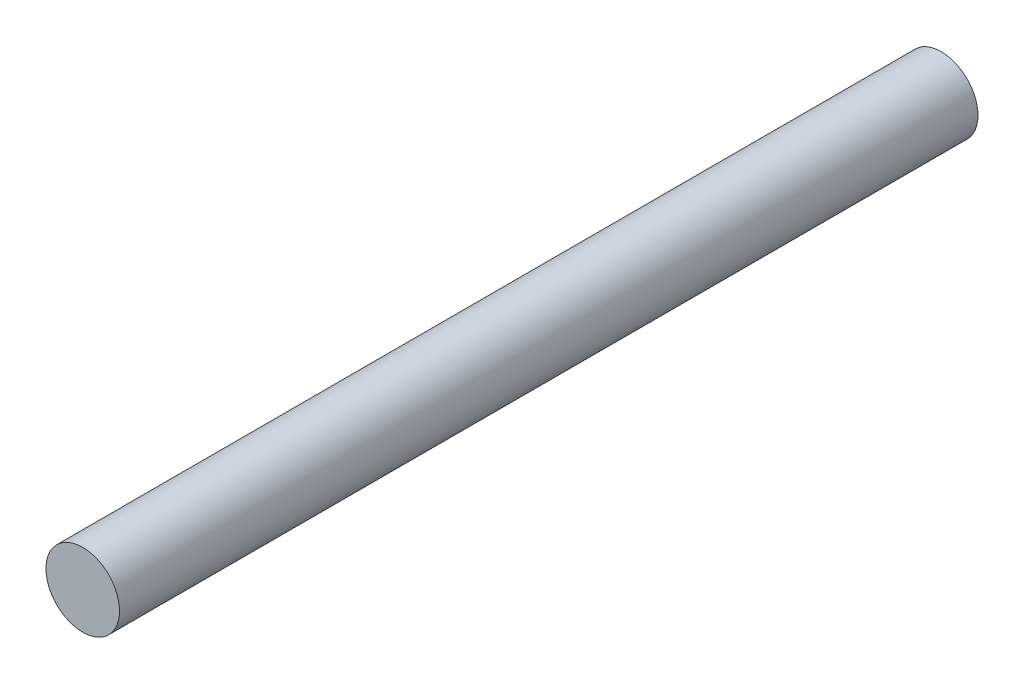
ISO-10303-21;
HEADER;
FILE_DESCRIPTION(('STEP AP214'),'2;1');
FILE_NAME('part.step','',(''),(''),'','','');
FILE_SCHEMA(('AUTOMOTIVE_DESIGN { 1 0 10303 214 1 1 1 1 }'));
ENDSEC;
DATA;
#1=APPLICATION_CONTEXT('core data for automotive mechanical design processes');
#2=APPLICATION_PROTOCOL_DEFINITION('international standard','automotive_design',2000,#1);
#3=PRODUCT_CONTEXT('',#1,'mechanical');
#4=PRODUCT('Part','Part','',(#3));
#5=PRODUCT_RELATED_PRODUCT_CATEGORY('part','',(#4));
#6=PRODUCT_DEFINITION_FORMATION('','',#4);
#7=PRODUCT_DEFINITION_CONTEXT('part definition',#1,'design');
#8=PRODUCT_DEFINITION('design','',#6,#7);
#9=PRODUCT_DEFINITION_SHAPE('','',#8);
#10=(LENGTH_UNIT() NAMED_UNIT(*) SI_UNIT(.MILLI.,.METRE.));
#11=(NAMED_UNIT(*) PLANE_ANGLE_UNIT() SI_UNIT($,.RADIAN.));
#12=(NAMED_UNIT(*) SI_UNIT($,.STERADIAN.) SOLID_ANGLE_UNIT());
#13=UNCERTAINTY_MEASURE_WITH_UNIT(LENGTH_MEASURE(1.E-05),#10,'distance_accuracy_value','');
#14=(GEOMETRIC_REPRESENTATION_CONTEXT(3) GLOBAL_UNCERTAINTY_ASSIGNED_CONTEXT((#13)) GLOBAL_UNIT_ASSIGNED_CONTEXT((#10,
#11,#12)) REPRESENTATION_CONTEXT('',''));
#15=CARTESIAN_POINT('',(0.,0.,0.));
#16=DIRECTION('',(0.,0.,1.));
#17=DIRECTION('',(1.,0.,0.));
#18=AXIS2_PLACEMENT_3D('',#15,#16,#17);
#19=CARTESIAN_POINT('',(0.,0.,35.));
#20=DIRECTION('',(0.,0.,-1.));
#21=DIRECTION('',(-1.,0.,0.));
#22=AXIS2_PLACEMENT_3D('',#19,#20,#21);
#23=CYLINDRICAL_SURFACE('',#22,3.);
#24=CARTESIAN_POINT('',(0.,0.,35.));
#25=DIRECTION('',(0.,0.,1.));
#26=DIRECTION('',(1.,0.,0.));
#27=AXIS2_PLACEMENT_3D('',#24,#25,#26);
#28=CIRCLE('',#27,3.);
#29=CARTESIAN_POINT('',(3.,0.,35.));
#30=VERTEX_POINT('',#29);
#31=EDGE_CURVE('E10',#30,#30,#28,.T.);
#32=ORIENTED_EDGE('',*,*,#31,.F.);
#33=EDGE_LOOP('',(#32));
#34=FACE_BOUND('',#33,.T.);
#35=CARTESIAN_POINT('',(0.,0.,-35.));
#36=DIRECTION('',(0.,0.,1.));
#37=DIRECTION('',(1.,0.,0.));
#38=AXIS2_PLACEMENT_3D('',#35,#36,#37);
#39=CIRCLE('',#38,3.);
#40=CARTESIAN_POINT('',(3.,0.,-35.));
#41=VERTEX_POINT('',#40);
#42=EDGE_CURVE('E33',#41,#41,#39,.T.);
#43=ORIENTED_EDGE('',*,*,#42,.T.);
#44=EDGE_LOOP('',(#43));
#45=FACE_BOUND('',#44,.T.);
#46=ADVANCED_FACE('F30',(#34,#45),#23,.T.);
#47=CARTESIAN_POINT('',(0.,0.,35.));
#48=DIRECTION('',(0.,0.,1.));
#49=DIRECTION('',(1.,0.,0.));
#50=AXIS2_PLACEMENT_3D('',#47,#48,#49);
#51=PLANE('',#50);
#52=ORIENTED_EDGE('',*,*,#31,.T.);
#53=EDGE_LOOP('',(#52));
#54=FACE_BOUND('',#53,.T.);
#55=ADVANCED_FACE('F45',(#54),#51,.T.);
#56=CARTESIAN_POINT('',(0.,0.,-35.));
#57=DIRECTION('',(0.,0.,1.));
#58=DIRECTION('',(1.,0.,0.));
#59=AXIS2_PLACEMENT_3D('',#56,#57,#58);
#60=PLANE('',#59);
#61=ORIENTED_EDGE('',*,*,#42,.F.);
#62=EDGE_LOOP('',(#61));
#63=FACE_BOUND('',#62,.T.);
#64=ADVANCED_FACE('F43',(#63),#60,.F.);
#65=CLOSED_SHELL('',(#46,#55,#64));
#66=MANIFOLD_SOLID_BREP('B2',#65);
#67=ADVANCED_BREP_SHAPE_REPRESENTATION('',(#18,#66),#14);
#68=SHAPE_DEFINITION_REPRESENTATION(#9,#67);
ENDSEC;
END-ISO-10303-21;
